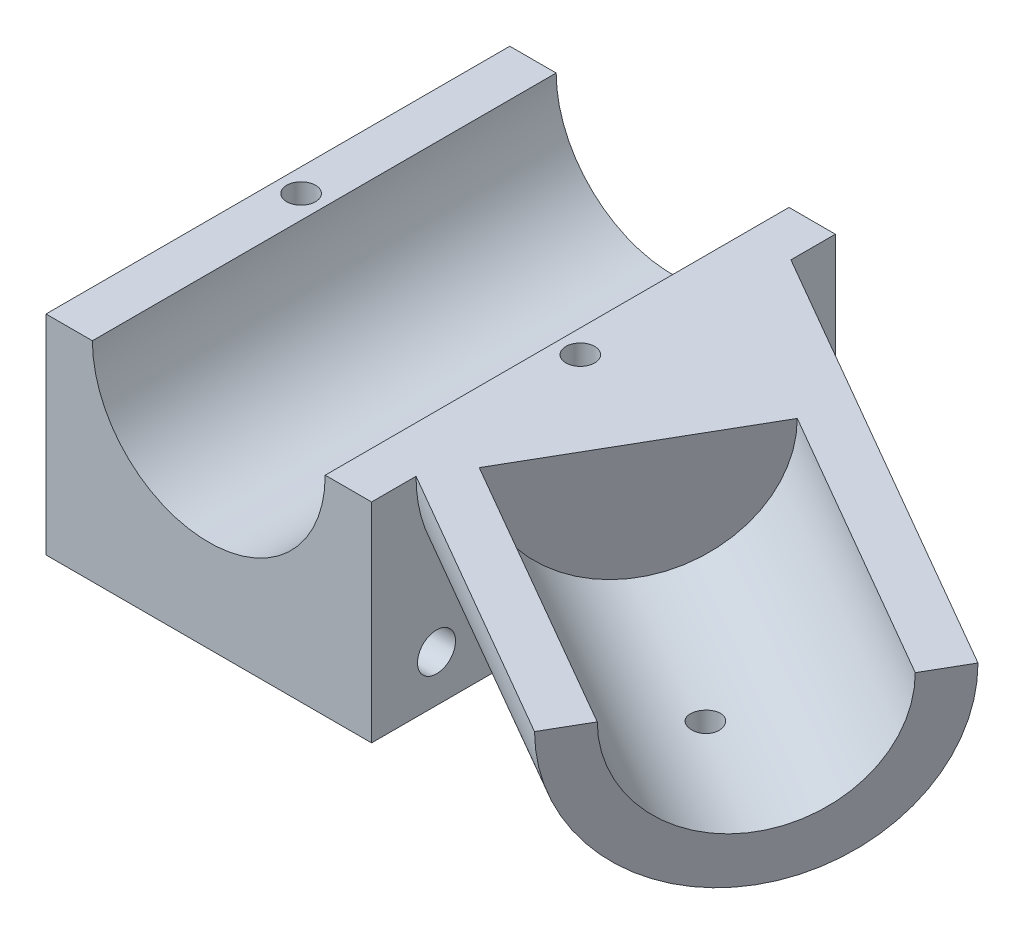
ISO-10303-21;
HEADER;
FILE_DESCRIPTION(('STEP AP214'),'2;1');
FILE_NAME('part.step','',(''),(''),'','','');
FILE_SCHEMA(('AUTOMOTIVE_DESIGN { 1 0 10303 214 1 1 1 1 }'));
ENDSEC;
DATA;
#1=APPLICATION_CONTEXT('core data for automotive mechanical design processes');
#2=APPLICATION_PROTOCOL_DEFINITION('international standard','automotive_design',2000,#1);
#3=PRODUCT_CONTEXT('',#1,'mechanical');
#4=PRODUCT('Part','Part','',(#3));
#5=PRODUCT_RELATED_PRODUCT_CATEGORY('part','',(#4));
#6=PRODUCT_DEFINITION_FORMATION('','',#4);
#7=PRODUCT_DEFINITION_CONTEXT('part definition',#1,'design');
#8=PRODUCT_DEFINITION('design','',#6,#7);
#9=PRODUCT_DEFINITION_SHAPE('','',#8);
#10=(LENGTH_UNIT() NAMED_UNIT(*) SI_UNIT(.MILLI.,.METRE.));
#11=(NAMED_UNIT(*) PLANE_ANGLE_UNIT() SI_UNIT($,.RADIAN.));
#12=(NAMED_UNIT(*) SI_UNIT($,.STERADIAN.) SOLID_ANGLE_UNIT());
#13=UNCERTAINTY_MEASURE_WITH_UNIT(LENGTH_MEASURE(1.E-05),#10,'distance_accuracy_value','');
#14=(GEOMETRIC_REPRESENTATION_CONTEXT(3) GLOBAL_UNCERTAINTY_ASSIGNED_CONTEXT((#13)) GLOBAL_UNIT_ASSIGNED_CONTEXT((#10,
#11,#12)) REPRESENTATION_CONTEXT('',''));
#15=CARTESIAN_POINT('',(0.,0.,0.));
#16=DIRECTION('',(0.,0.,1.));
#17=DIRECTION('',(1.,0.,0.));
#18=AXIS2_PLACEMENT_3D('',#15,#16,#17);
#19=CARTESIAN_POINT('',(17.55,0.,25.));
#20=DIRECTION('',(-1.,0.,0.));
#21=DIRECTION('',(0.,-1.,0.));
#22=AXIS2_PLACEMENT_3D('',#19,#20,#21);
#23=PLANE('',#22);
#24=CARTESIAN_POINT('',(17.55,5.,-18.));
#25=DIRECTION('',(-1.,0.,0.));
#26=DIRECTION('',(0.,-1.,0.));
#27=AXIS2_PLACEMENT_3D('',#24,#25,#26);
#28=CIRCLE('',#27,2.05);
#29=CARTESIAN_POINT('',(17.55,2.95,-18.));
#30=VERTEX_POINT('',#29);
#31=EDGE_CURVE('E283',#30,#30,#28,.F.);
#32=ORIENTED_EDGE('',*,*,#31,.F.);
#33=EDGE_LOOP('',(#32));
#34=FACE_BOUND('',#33,.T.);
#35=CARTESIAN_POINT('',(17.55,5.,18.));
#36=DIRECTION('',(-1.,0.,0.));
#37=DIRECTION('',(0.,-1.,0.));
#38=AXIS2_PLACEMENT_3D('',#35,#36,#37);
#39=CIRCLE('',#38,2.05);
#40=CARTESIAN_POINT('',(17.55,2.95,18.));
#41=VERTEX_POINT('',#40);
#42=EDGE_CURVE('E279',#41,#41,#39,.F.);
#43=ORIENTED_EDGE('',*,*,#42,.F.);
#44=EDGE_LOOP('',(#43));
#45=FACE_BOUND('',#44,.T.);
#46=CARTESIAN_POINT('',(17.55,22.5,0.));
#47=DIRECTION('',(-1.,0.,0.));
#48=DIRECTION('',(0.,0.,1.));
#49=AXIS2_PLACEMENT_3D('',#46,#47,#48);
#50=ELLIPSE('',#49,20.2072594216369,17.5);
#51=CARTESIAN_POINT('',(17.55,22.5,20.2072594216369));
#52=VERTEX_POINT('',#51);
#53=CARTESIAN_POINT('',(17.55,22.5,-20.2072594216369));
#54=VERTEX_POINT('',#53);
#55=EDGE_CURVE('E59',#52,#54,#50,.F.);
#56=ORIENTED_EDGE('',*,*,#55,.F.);
#57=DIRECTION('',(0.,0.,-1.));
#58=VECTOR('',#57,1.);
#59=CARTESIAN_POINT('',(17.55,22.5,25.));
#60=LINE('',#59,#58);
#61=CARTESIAN_POINT('',(17.55,22.5,25.));
#62=VERTEX_POINT('',#61);
#63=EDGE_CURVE('E190',#62,#52,#60,.T.);
#64=ORIENTED_EDGE('',*,*,#63,.F.);
#65=DIRECTION('',(0.,1.,0.));
#66=VECTOR('',#65,1.);
#67=CARTESIAN_POINT('',(17.55,0.,25.));
#68=LINE('',#67,#66);
#69=CARTESIAN_POINT('',(17.55,0.,25.));
#70=VERTEX_POINT('',#69);
#71=EDGE_CURVE('E167',#70,#62,#68,.T.);
#72=ORIENTED_EDGE('',*,*,#71,.F.);
#73=DIRECTION('',(0.,0.,-1.));
#74=VECTOR('',#73,1.);
#75=CARTESIAN_POINT('',(17.55,0.,25.));
#76=LINE('',#75,#74);
#77=CARTESIAN_POINT('',(17.55,0.,-25.));
#78=VERTEX_POINT('',#77);
#79=EDGE_CURVE('E192',#70,#78,#76,.T.);
#80=ORIENTED_EDGE('',*,*,#79,.T.);
#81=DIRECTION('',(0.,1.,0.));
#82=VECTOR('',#81,1.);
#83=CARTESIAN_POINT('',(17.55,0.,-25.));
#84=LINE('',#83,#82);
#85=CARTESIAN_POINT('',(17.55,22.5,-25.));
#86=VERTEX_POINT('',#85);
#87=EDGE_CURVE('E180',#78,#86,#84,.T.);
#88=ORIENTED_EDGE('',*,*,#87,.T.);
#89=EDGE_CURVE('E54',#54,#86,#60,.T.);
#90=ORIENTED_EDGE('',*,*,#89,.F.);
#91=EDGE_LOOP('',(#56,#64,#72,#80,#88,#90));
#92=FACE_BOUND('',#91,.T.);
#93=ADVANCED_FACE('F33',(#34,#45,#92),#23,.F.);
#94=CARTESIAN_POINT('',(-17.55,22.5,25.));
#95=DIRECTION('',(0.,-1.,0.));
#96=DIRECTION('',(0.,0.,-1.));
#97=AXIS2_PLACEMENT_3D('',#94,#95,#96);
#98=PLANE('',#97);
#99=CARTESIAN_POINT('',(-15.05,22.5,0.));
#100=DIRECTION('',(0.,1.,0.));
#101=DIRECTION('',(0.,0.,1.));
#102=AXIS2_PLACEMENT_3D('',#99,#100,#101);
#103=CIRCLE('',#102,1.55);
#104=CARTESIAN_POINT('',(-15.05,22.5,1.55));
#105=VERTEX_POINT('',#104);
#106=EDGE_CURVE('E147',#105,#105,#103,.T.);
#107=ORIENTED_EDGE('',*,*,#106,.F.);
#108=EDGE_LOOP('',(#107));
#109=FACE_BOUND('',#108,.T.);
#110=DIRECTION('',(-1.,0.,0.));
#111=VECTOR('',#110,1.);
#112=CARTESIAN_POINT('',(-17.55,22.5,-25.));
#113=LINE('',#112,#111);
#114=CARTESIAN_POINT('',(-12.55,22.5,-25.));
#115=VERTEX_POINT('',#114);
#116=CARTESIAN_POINT('',(-17.55,22.5,-25.));
#117=VERTEX_POINT('',#116);
#118=EDGE_CURVE('E154',#115,#117,#113,.T.);
#119=ORIENTED_EDGE('',*,*,#118,.T.);
#120=DIRECTION('',(0.,0.,-1.));
#121=VECTOR('',#120,1.);
#122=CARTESIAN_POINT('',(-17.55,22.5,25.));
#123=LINE('',#122,#121);
#124=CARTESIAN_POINT('',(-17.55,22.5,25.));
#125=VERTEX_POINT('',#124);
#126=EDGE_CURVE('E11',#125,#117,#123,.T.);
#127=ORIENTED_EDGE('',*,*,#126,.F.);
#128=DIRECTION('',(-1.,0.,0.));
#129=VECTOR('',#128,1.);
#130=CARTESIAN_POINT('',(-17.55,22.5,25.));
#131=LINE('',#130,#129);
#132=CARTESIAN_POINT('',(-12.55,22.5,25.));
#133=VERTEX_POINT('',#132);
#134=EDGE_CURVE('E159',#133,#125,#131,.T.);
#135=ORIENTED_EDGE('',*,*,#134,.F.);
#136=DIRECTION('',(0.,0.,-1.));
#137=VECTOR('',#136,1.);
#138=CARTESIAN_POINT('',(-12.55,22.5,25.));
#139=LINE('',#138,#137);
#140=EDGE_CURVE('E173',#133,#115,#139,.T.);
#141=ORIENTED_EDGE('',*,*,#140,.T.);
#142=EDGE_LOOP('',(#119,#127,#135,#141));
#143=FACE_BOUND('',#142,.T.);
#144=ADVANCED_FACE('F35',(#109,#143),#98,.F.);
#145=CARTESIAN_POINT('',(-17.55,22.5,25.));
#146=DIRECTION('',(1.,0.,0.));
#147=DIRECTION('',(0.,1.,0.));
#148=AXIS2_PLACEMENT_3D('',#145,#146,#147);
#149=PLANE('',#148);
#150=CARTESIAN_POINT('',(-17.55,5.,-18.));
#151=DIRECTION('',(-1.,0.,0.));
#152=DIRECTION('',(0.,0.,1.));
#153=AXIS2_PLACEMENT_3D('',#150,#151,#152);
#154=CIRCLE('',#153,2.05);
#155=CARTESIAN_POINT('',(-17.55,5.,-15.95));
#156=VERTEX_POINT('',#155);
#157=EDGE_CURVE('E275',#156,#156,#154,.T.);
#158=ORIENTED_EDGE('',*,*,#157,.F.);
#159=EDGE_LOOP('',(#158));
#160=FACE_BOUND('',#159,.T.);
#161=CARTESIAN_POINT('',(-17.55,5.,18.));
#162=DIRECTION('',(-1.,0.,0.));
#163=DIRECTION('',(0.,0.,1.));
#164=AXIS2_PLACEMENT_3D('',#161,#162,#163);
#165=CIRCLE('',#164,2.05);
#166=CARTESIAN_POINT('',(-17.55,5.,20.05));
#167=VERTEX_POINT('',#166);
#168=EDGE_CURVE('E123',#167,#167,#165,.T.);
#169=ORIENTED_EDGE('',*,*,#168,.F.);
#170=EDGE_LOOP('',(#169));
#171=FACE_BOUND('',#170,.T.);
#172=DIRECTION('',(0.,-1.,0.));
#173=VECTOR('',#172,1.);
#174=CARTESIAN_POINT('',(-17.55,22.5,-25.));
#175=LINE('',#174,#173);
#176=CARTESIAN_POINT('',(-17.55,0.,-25.));
#177=VERTEX_POINT('',#176);
#178=EDGE_CURVE('E176',#117,#177,#175,.T.);
#179=ORIENTED_EDGE('',*,*,#178,.T.);
#180=DIRECTION('',(0.,0.,-1.));
#181=VECTOR('',#180,1.);
#182=CARTESIAN_POINT('',(-17.55,0.,25.));
#183=LINE('',#182,#181);
#184=CARTESIAN_POINT('',(-17.55,0.,25.));
#185=VERTEX_POINT('',#184);
#186=EDGE_CURVE('E47',#185,#177,#183,.T.);
#187=ORIENTED_EDGE('',*,*,#186,.F.);
#188=DIRECTION('',(0.,-1.,0.));
#189=VECTOR('',#188,1.);
#190=CARTESIAN_POINT('',(-17.55,22.5,25.));
#191=LINE('',#190,#189);
#192=EDGE_CURVE('E162',#125,#185,#191,.T.);
#193=ORIENTED_EDGE('',*,*,#192,.F.);
#194=ORIENTED_EDGE('',*,*,#126,.T.);
#195=EDGE_LOOP('',(#179,#187,#193,#194));
#196=FACE_BOUND('',#195,.T.);
#197=ADVANCED_FACE('F216',(#160,#171,#196),#149,.F.);
#198=CARTESIAN_POINT('',(-17.55,0.,25.));
#199=DIRECTION('',(0.,1.,0.));
#200=DIRECTION('',(0.,0.,1.));
#201=AXIS2_PLACEMENT_3D('',#198,#199,#200);
#202=PLANE('',#201);
#203=CARTESIAN_POINT('',(-15.05,0.,0.));
#204=DIRECTION('',(0.,1.,0.));
#205=DIRECTION('',(0.,0.,1.));
#206=AXIS2_PLACEMENT_3D('',#203,#204,#205);
#207=CIRCLE('',#206,1.55);
#208=CARTESIAN_POINT('',(-15.05,0.,1.55));
#209=VERTEX_POINT('',#208);
#210=EDGE_CURVE('E150',#209,#209,#207,.F.);
#211=ORIENTED_EDGE('',*,*,#210,.F.);
#212=EDGE_LOOP('',(#211));
#213=FACE_BOUND('',#212,.T.);
#214=CARTESIAN_POINT('',(15.05,0.,0.));
#215=DIRECTION('',(0.,1.,0.));
#216=DIRECTION('',(0.,0.,1.));
#217=AXIS2_PLACEMENT_3D('',#214,#215,#216);
#218=CIRCLE('',#217,1.55);
#219=CARTESIAN_POINT('',(15.05,0.,1.55));
#220=VERTEX_POINT('',#219);
#221=EDGE_CURVE('E151',#220,#220,#218,.F.);
#222=ORIENTED_EDGE('',*,*,#221,.F.);
#223=EDGE_LOOP('',(#222));
#224=FACE_BOUND('',#223,.T.);
#225=DIRECTION('',(1.,0.,0.));
#226=VECTOR('',#225,1.);
#227=CARTESIAN_POINT('',(-17.55,0.,-25.));
#228=LINE('',#227,#226);
#229=EDGE_CURVE('E178',#177,#78,#228,.T.);
#230=ORIENTED_EDGE('',*,*,#229,.T.);
#231=ORIENTED_EDGE('',*,*,#79,.F.);
#232=DIRECTION('',(1.,0.,0.));
#233=VECTOR('',#232,1.);
#234=CARTESIAN_POINT('',(-17.55,0.,25.));
#235=LINE('',#234,#233);
#236=EDGE_CURVE('E165',#185,#70,#235,.T.);
#237=ORIENTED_EDGE('',*,*,#236,.F.);
#238=ORIENTED_EDGE('',*,*,#186,.T.);
#239=EDGE_LOOP('',(#230,#231,#237,#238));
#240=FACE_BOUND('',#239,.T.);
#241=ADVANCED_FACE('F200',(#213,#224,#240),#202,.F.);
#242=CARTESIAN_POINT('',(17.55,22.5,25.));
#243=DIRECTION('',(0.,-1.,0.));
#244=DIRECTION('',(0.,0.,-1.));
#245=AXIS2_PLACEMENT_3D('',#242,#243,#244);
#246=PLANE('',#245);
#247=DIRECTION('',(-0.5,0.,0.866025403784439));
#248=VECTOR('',#247,1.);
#249=CARTESIAN_POINT('',(20.1480762113533,22.5,15.9914917566596));
#250=LINE('',#249,#248);
#251=CARTESIAN_POINT('',(32.6980762113533,22.5,-5.74574587832974));
#252=VERTEX_POINT('',#251);
#253=CARTESIAN_POINT('',(20.1480762113533,22.5,15.9914917566596));
#254=VERTEX_POINT('',#253);
#255=EDGE_CURVE('E115',#252,#254,#250,.T.);
#256=ORIENTED_EDGE('',*,*,#255,.F.);
#257=DIRECTION('',(-0.866025403784438,0.,-0.500000000000001));
#258=VECTOR('',#257,1.);
#259=CARTESIAN_POINT('',(62.7961431702997,22.5,11.6313811825053));
#260=LINE('',#259,#258);
#261=CARTESIAN_POINT('',(62.7961431702997,22.5,11.6313811825053));
#262=VERTEX_POINT('',#261);
#263=EDGE_CURVE('E131',#262,#252,#260,.T.);
#264=ORIENTED_EDGE('',*,*,#263,.F.);
#265=DIRECTION('',(-0.500000000000001,0.,0.866025403784438));
#266=VECTOR('',#265,1.);
#267=CARTESIAN_POINT('',(62.7961431702997,22.5,11.6313811825053));
#268=LINE('',#267,#266);
#269=CARTESIAN_POINT('',(65.2711431702997,22.5,7.34455543377238));
#270=VERTEX_POINT('',#269);
#271=EDGE_CURVE('E223',#270,#262,#268,.T.);
#272=ORIENTED_EDGE('',*,*,#271,.F.);
#273=DIRECTION('',(-0.866025403784438,0.,-0.500000000000001));
#274=VECTOR('',#273,1.);
#275=CARTESIAN_POINT('',(65.2711431702997,22.5,7.34455543377238));
#276=LINE('',#275,#274);
#277=EDGE_CURVE('E139',#270,#54,#276,.T.);
#278=ORIENTED_EDGE('',*,*,#277,.T.);
#279=ORIENTED_EDGE('',*,*,#89,.T.);
#280=DIRECTION('',(-1.,0.,0.));
#281=VECTOR('',#280,1.);
#282=CARTESIAN_POINT('',(17.55,22.5,-25.));
#283=LINE('',#282,#281);
#284=CARTESIAN_POINT('',(12.55,22.5,-25.));
#285=VERTEX_POINT('',#284);
#286=EDGE_CURVE('E182',#86,#285,#283,.T.);
#287=ORIENTED_EDGE('',*,*,#286,.T.);
#288=DIRECTION('',(0.,0.,-1.));
#289=VECTOR('',#288,1.);
#290=CARTESIAN_POINT('',(12.55,22.5,25.));
#291=LINE('',#290,#289);
#292=CARTESIAN_POINT('',(12.55,22.5,25.));
#293=VERTEX_POINT('',#292);
#294=EDGE_CURVE('E187',#293,#285,#291,.T.);
#295=ORIENTED_EDGE('',*,*,#294,.F.);
#296=DIRECTION('',(-1.,0.,0.));
#297=VECTOR('',#296,1.);
#298=CARTESIAN_POINT('',(17.55,22.5,25.));
#299=LINE('',#298,#297);
#300=EDGE_CURVE('E169',#62,#293,#299,.T.);
#301=ORIENTED_EDGE('',*,*,#300,.F.);
#302=ORIENTED_EDGE('',*,*,#63,.T.);
#303=DIRECTION('',(-0.866025403784438,0.,-0.500000000000001));
#304=VECTOR('',#303,1.);
#305=CARTESIAN_POINT('',(47.7711431702997,22.5,37.6554445662277));
#306=LINE('',#305,#304);
#307=CARTESIAN_POINT('',(47.7711431702997,22.5,37.6554445662277));
#308=VERTEX_POINT('',#307);
#309=EDGE_CURVE('E137',#308,#52,#306,.T.);
#310=ORIENTED_EDGE('',*,*,#309,.F.);
#311=DIRECTION('',(-0.500000000000001,0.,0.866025403784438));
#312=VECTOR('',#311,1.);
#313=CARTESIAN_POINT('',(47.7711431702997,22.5,37.6554445662277));
#314=LINE('',#313,#312);
#315=CARTESIAN_POINT('',(50.2461431702997,22.5,33.3686188174947));
#316=VERTEX_POINT('',#315);
#317=EDGE_CURVE('E136',#316,#308,#314,.T.);
#318=ORIENTED_EDGE('',*,*,#317,.F.);
#319=DIRECTION('',(-0.866025403784438,0.,-0.500000000000001));
#320=VECTOR('',#319,1.);
#321=CARTESIAN_POINT('',(50.2461431702997,22.5,33.3686188174947));
#322=LINE('',#321,#320);
#323=EDGE_CURVE('E129',#316,#254,#322,.T.);
#324=ORIENTED_EDGE('',*,*,#323,.T.);
#325=EDGE_LOOP('',(#256,#264,#272,#278,#279,#287,#295,#301,#302,#310,#318,#324));
#326=FACE_BOUND('',#325,.T.);
#327=CARTESIAN_POINT('',(15.05,22.5,0.));
#328=DIRECTION('',(0.,1.,0.));
#329=DIRECTION('',(0.,0.,1.));
#330=AXIS2_PLACEMENT_3D('',#327,#328,#329);
#331=CIRCLE('',#330,1.55);
#332=CARTESIAN_POINT('',(15.05,22.5,1.55));
#333=VERTEX_POINT('',#332);
#334=EDGE_CURVE('E146',#333,#333,#331,.T.);
#335=ORIENTED_EDGE('',*,*,#334,.F.);
#336=EDGE_LOOP('',(#335));
#337=FACE_BOUND('',#336,.T.);
#338=ADVANCED_FACE('F133',(#326,#337),#246,.F.);
#339=CARTESIAN_POINT('',(0.,22.5,25.));
#340=DIRECTION('',(0.,0.,-1.));
#341=DIRECTION('',(-1.,0.,0.));
#342=AXIS2_PLACEMENT_3D('',#339,#340,#341);
#343=CYLINDRICAL_SURFACE('',#342,12.55);
#344=CARTESIAN_POINT('',(0.,22.5,-25.));
#345=DIRECTION('',(0.,0.,-1.));
#346=DIRECTION('',(1.,0.,0.));
#347=AXIS2_PLACEMENT_3D('',#344,#345,#346);
#348=CIRCLE('',#347,12.55);
#349=EDGE_CURVE('E163',#285,#115,#348,.T.);
#350=ORIENTED_EDGE('',*,*,#349,.T.);
#351=ORIENTED_EDGE('',*,*,#140,.F.);
#352=CARTESIAN_POINT('',(0.,22.5,25.));
#353=DIRECTION('',(0.,0.,-1.));
#354=DIRECTION('',(1.,0.,0.));
#355=AXIS2_PLACEMENT_3D('',#352,#353,#354);
#356=CIRCLE('',#355,12.55);
#357=EDGE_CURVE('E171',#293,#133,#356,.T.);
#358=ORIENTED_EDGE('',*,*,#357,.F.);
#359=ORIENTED_EDGE('',*,*,#294,.T.);
#360=EDGE_LOOP('',(#350,#351,#358,#359));
#361=FACE_BOUND('',#360,.T.);
#362=ADVANCED_FACE('F220',(#361),#343,.F.);
#363=CARTESIAN_POINT('',(0.,22.5,25.));
#364=DIRECTION('',(0.,0.,1.));
#365=DIRECTION('',(1.,0.,0.));
#366=AXIS2_PLACEMENT_3D('',#363,#364,#365);
#367=PLANE('',#366);
#368=ORIENTED_EDGE('',*,*,#134,.T.);
#369=ORIENTED_EDGE('',*,*,#192,.T.);
#370=ORIENTED_EDGE('',*,*,#236,.T.);
#371=ORIENTED_EDGE('',*,*,#71,.T.);
#372=ORIENTED_EDGE('',*,*,#300,.T.);
#373=ORIENTED_EDGE('',*,*,#357,.T.);
#374=EDGE_LOOP('',(#368,#369,#370,#371,#372,#373));
#375=FACE_BOUND('',#374,.T.);
#376=ADVANCED_FACE('F212',(#375),#367,.T.);
#377=CARTESIAN_POINT('',(0.,22.5,-25.));
#378=DIRECTION('',(0.,0.,1.));
#379=DIRECTION('',(1.,0.,0.));
#380=AXIS2_PLACEMENT_3D('',#377,#378,#379);
#381=PLANE('',#380);
#382=ORIENTED_EDGE('',*,*,#118,.F.);
#383=ORIENTED_EDGE('',*,*,#349,.F.);
#384=ORIENTED_EDGE('',*,*,#286,.F.);
#385=ORIENTED_EDGE('',*,*,#87,.F.);
#386=ORIENTED_EDGE('',*,*,#229,.F.);
#387=ORIENTED_EDGE('',*,*,#178,.F.);
#388=EDGE_LOOP('',(#382,#383,#384,#385,#386,#387));
#389=FACE_BOUND('',#388,.T.);
#390=ADVANCED_FACE('F206',(#389),#381,.F.);
#391=CARTESIAN_POINT('',(15.05,-4.3840620433566,0.));
#392=DIRECTION('',(0.,1.,0.));
#393=DIRECTION('',(0.,0.,1.));
#394=AXIS2_PLACEMENT_3D('',#391,#392,#393);
#395=CYLINDRICAL_SURFACE('',#394,1.55);
#396=ORIENTED_EDGE('',*,*,#221,.T.);
#397=EDGE_LOOP('',(#396));
#398=FACE_BOUND('',#397,.T.);
#399=ORIENTED_EDGE('',*,*,#334,.T.);
#400=EDGE_LOOP('',(#399));
#401=FACE_BOUND('',#400,.T.);
#402=ADVANCED_FACE('F363',(#398,#401),#395,.F.);
#403=CARTESIAN_POINT('',(-15.05,-4.3840620433566,0.));
#404=DIRECTION('',(0.,1.,0.));
#405=DIRECTION('',(0.,0.,1.));
#406=AXIS2_PLACEMENT_3D('',#403,#404,#405);
#407=CYLINDRICAL_SURFACE('',#406,1.55);
#408=ORIENTED_EDGE('',*,*,#210,.T.);
#409=EDGE_LOOP('',(#408));
#410=FACE_BOUND('',#409,.T.);
#411=ORIENTED_EDGE('',*,*,#106,.T.);
#412=EDGE_LOOP('',(#411));
#413=FACE_BOUND('',#412,.T.);
#414=ADVANCED_FACE('F369',(#410,#413),#407,.F.);
#415=CARTESIAN_POINT('',(56.5211431702997,22.5,22.5));
#416=DIRECTION('',(-0.866025403784438,0.,-0.500000000000001));
#417=DIRECTION('',(-0.500000000000001,0.,0.866025403784438));
#418=AXIS2_PLACEMENT_3D('',#415,#416,#417);
#419=CYLINDRICAL_SURFACE('',#418,17.5);
#420=CARTESIAN_POINT('',(41.9807621135332,5.01716913654998,15.));
#421=CARTESIAN_POINT('',(41.9807657759947,5.01383662006701,14.913178147149));
#422=CARTESIAN_POINT('',(41.9880805438422,5.01082839824436,14.826286240255));
#423=CARTESIAN_POINT('',(42.0171727847243,5.00580127031913,14.654860968194));
#424=CARTESIAN_POINT('',(42.038965840308,5.00378343421215,14.5703302465553));
#425=CARTESIAN_POINT('',(42.0964109955829,5.00096725665342,14.4061164094643));
#426=CARTESIAN_POINT('',(42.1320586741092,5.00016852657154,14.3264317569487));
#427=CARTESIAN_POINT('',(42.2161949497872,4.99987974246332,14.1741808235086));
#428=CARTESIAN_POINT('',(42.2646805861065,5.00038938692047,14.101612906525));
#429=CARTESIAN_POINT('',(42.3730246558008,5.0026573955707,13.9657460127227));
#430=CARTESIAN_POINT('',(42.432864789978,5.00441376282869,13.90243240815));
#431=CARTESIAN_POINT('',(42.5622688969692,5.00897651481142,13.786717069692));
#432=CARTESIAN_POINT('',(42.6318333369309,5.01178294999143,13.7343158603305));
#433=CARTESIAN_POINT('',(42.7788508262595,5.01813823538495,13.6418077880952));
#434=CARTESIAN_POINT('',(42.8563179211583,5.02168841970078,13.6017233415664));
#435=CARTESIAN_POINT('',(43.0168557364662,5.02913117675068,13.5350926049501));
#436=CARTESIAN_POINT('',(43.0999265727142,5.03302375656317,13.5085465948223));
#437=CARTESIAN_POINT('',(43.2696258847987,5.04072877895562,13.4696699663186));
#438=CARTESIAN_POINT('',(43.3562652333685,5.04454091338457,13.457386725602));
#439=CARTESIAN_POINT('',(43.5303980237424,5.05164144011879,13.44754887423));
#440=CARTESIAN_POINT('',(43.6178914619267,5.05492983464278,13.4499942011784));
#441=CARTESIAN_POINT('',(43.7912231935161,5.06060907638196,13.4695543878783));
#442=CARTESIAN_POINT('',(43.8770620550395,5.06300023707504,13.4866641172683));
#443=CARTESIAN_POINT('',(44.0446663242073,5.06661414653735,13.5350731648724));
#444=CARTESIAN_POINT('',(44.1264318269812,5.06783692260528,13.5663721515367));
#445=CARTESIAN_POINT('',(44.2832718821034,5.06897232868954,13.6421386086808));
#446=CARTESIAN_POINT('',(44.3583687872732,5.06888951565134,13.6865597457972));
#447=CARTESIAN_POINT('',(44.5000530409642,5.06743434183761,13.7873446481524));
#448=CARTESIAN_POINT('',(44.5666404559062,5.06606199112824,13.8437083201648));
#449=CARTESIAN_POINT('',(44.6893479082733,5.06218590741732,13.9666964750813));
#450=CARTESIAN_POINT('',(44.745480150344,5.05968350539961,14.0333088263269));
#451=CARTESIAN_POINT('',(44.8458037436991,5.05382995383001,14.174955694493));
#452=CARTESIAN_POINT('',(44.8899948530948,5.05047878708756,14.2499903819791));
#453=CARTESIAN_POINT('',(44.9653194471605,5.04329294218684,14.4066045810336));
#454=CARTESIAN_POINT('',(44.9964136915189,5.03945685514601,14.4882029006129));
#455=CARTESIAN_POINT('',(45.0444861966706,5.03173992143045,14.6554556546848));
#456=CARTESIAN_POINT('',(45.061464220259,5.02785907400469,14.7411101573107));
#457=CARTESIAN_POINT('',(45.0808470111027,5.02047846570701,14.9142864772098));
#458=CARTESIAN_POINT('',(45.083215445864,5.01697967615835,15.0018124071132));
#459=CARTESIAN_POINT('',(45.0732024320952,5.01076865087211,15.1760450910998));
#460=CARTESIAN_POINT('',(45.0608211764509,5.00805640484927,15.2627518558804));
#461=CARTESIAN_POINT('',(45.0216834873487,5.00372872988006,15.4327172143567));
#462=CARTESIAN_POINT('',(44.9949538622353,5.00211126815142,15.5159819276787));
#463=CARTESIAN_POINT('',(44.9278886599814,5.00014754659018,15.6768540266142));
#464=CARTESIAN_POINT('',(44.887553389398,4.99980125811808,15.7544615396458));
#465=CARTESIAN_POINT('',(44.7945826296592,5.00041785805974,15.9015559470152));
#466=CARTESIAN_POINT('',(44.7419880258816,5.00137644499908,15.97106870669));
#467=CARTESIAN_POINT('',(44.6259258963292,5.00448759917551,16.1002995787996));
#468=CARTESIAN_POINT('',(44.562458334394,5.00664017038351,16.1600176586586));
#469=CARTESIAN_POINT('',(44.4264271719878,5.01189939044296,16.2680018017968));
#470=CARTESIAN_POINT('',(44.3538599692188,5.01500641784757,16.3162633077209));
#471=CARTESIAN_POINT('',(44.2016971333181,5.02182714460867,16.3999593943105));
#472=CARTESIAN_POINT('',(44.1221013422164,5.02554085760223,16.4353936865888));
#473=CARTESIAN_POINT('',(43.9578281173659,5.03317385659464,16.4925494262309));
#474=CARTESIAN_POINT('',(43.8731340242871,5.03709381059749,16.5142229113286));
#475=CARTESIAN_POINT('',(43.7012981010484,5.04468670776343,16.5430512811335));
#476=CARTESIAN_POINT('',(43.6141562472235,5.04835964853723,16.5502060254244));
#477=CARTESIAN_POINT('',(43.4397796297081,5.05504801662024,16.5497846885194));
#478=CARTESIAN_POINT('',(43.3525448756622,5.05806267528599,16.5421914881169));
#479=CARTESIAN_POINT('',(43.1805652576972,5.06308628556392,16.512440821276));
#480=CARTESIAN_POINT('',(43.0958203458407,5.06509525655076,16.490283635433));
#481=CARTESIAN_POINT('',(42.931488637064,5.06787394130967,16.4321124525438));
#482=CARTESIAN_POINT('',(42.8518873226342,5.06864730357014,16.3961396417309));
#483=CARTESIAN_POINT('',(42.6998461725477,5.06887806696386,16.311355869986));
#484=CARTESIAN_POINT('',(42.6274059616646,5.06833553708509,16.2625455822011));
#485=CARTESIAN_POINT('',(42.4919225469421,5.06599959234364,16.1536240802443));
#486=CARTESIAN_POINT('',(42.4288556718949,5.06420939574981,16.093542231021));
#487=CARTESIAN_POINT('',(42.313657595807,5.05958340959494,15.9636860427345));
#488=CARTESIAN_POINT('',(42.2615290396066,5.05674736760885,15.8939093662656));
#489=CARTESIAN_POINT('',(42.1695752716029,5.05034188192152,15.746484221453));
#490=CARTESIAN_POINT('',(42.1297791148813,5.04677073874745,15.6688177273204));
#491=CARTESIAN_POINT('',(42.0637965092253,5.03930347280106,15.5079876242804));
#492=CARTESIAN_POINT('',(42.0375953219174,5.03540770729548,15.4248300790039));
#493=CARTESIAN_POINT('',(42.0059937224513,5.02904072597403,15.2843522528059));
#494=CARTESIAN_POINT('',(41.9965450795259,5.02653753305671,15.2279109152589));
#495=CARTESIAN_POINT('',(41.9839280568564,5.02169905718401,15.1143231809311));
#496=CARTESIAN_POINT('',(41.9807597016085,5.0193637748836,15.057176781401));
#497=CARTESIAN_POINT('',(41.9807621135332,5.01716913654998,15.));
#498=B_SPLINE_CURVE_WITH_KNOTS('',3,(#420,#421,#422,#423,#424,#425,#426,#427,#428,#429,#430,
#431,#432,#433,#434,#435,#436,#437,#438,#439,#440,#441,#442,#443,#444,#445,#446,#447,#448,#449,
#450,#451,#452,#453,#454,#455,#456,#457,#458,#459,#460,#461,#462,#463,#464,#465,#466,#467,#468,
#469,#470,#471,#472,#473,#474,#475,#476,#477,#478,#479,#480,#481,#482,#483,#484,#485,#486,#487,
#488,#489,#490,#491,#492,#493,#494,#495,#496,#497),.UNSPECIFIED.,.T.,.F.,(4,2,2,2,2,2,2,2,2,2,2,
2,2,2,2,2,2,2,2,2,2,2,2,2,2,2,2,2,2,2,2,2,2,2,2,2,2,2,4),(0.,0.260449975240977,0.52118072011794,
0.781828331122857,1.04241588096019,1.30258697448213,1.56277057070823,1.82342493055854,
2.08408468023027,2.34560782717593,2.60712986620343,2.86856044871382,3.12998492288719,
3.39049714027234,3.65100732410743,3.91121147392941,4.1714208942494,4.43240449149244,
4.69339247414054,4.95502924533832,5.21666259508005,5.47780880462443,5.73894913051485,
5.99923069822643,6.2595131315784,6.51989893083308,6.78029058383521,7.04158490107967,
7.30288174539143,7.56448208067966,7.82607737602061,8.08689879924829,8.34770654874312,
8.60784404081797,8.86804436076629,9.12885313099139,9.38937856325417,9.56089797601423,
9.73241805778224),.UNSPECIFIED.);
#499=CARTESIAN_POINT('',(41.9807621135332,5.01716913654998,15.));
#500=VERTEX_POINT('',#499);
#501=EDGE_CURVE('E232',#500,#500,#498,.T.);
#502=ORIENTED_EDGE('',*,*,#501,.F.);
#503=EDGE_LOOP('',(#502));
#504=FACE_BOUND('',#503,.T.);
#505=ORIENTED_EDGE('',*,*,#309,.T.);
#506=ORIENTED_EDGE('',*,*,#55,.T.);
#507=ORIENTED_EDGE('',*,*,#277,.F.);
#508=CARTESIAN_POINT('',(56.5211431702997,22.5,22.5));
#509=DIRECTION('',(0.866025403784438,0.,0.500000000000001));
#510=DIRECTION('',(0.500000000000001,0.,-0.866025403784438));
#511=AXIS2_PLACEMENT_3D('',#508,#509,#510);
#512=CIRCLE('',#511,17.5);
#513=EDGE_CURVE('E228',#308,#270,#512,.T.);
#514=ORIENTED_EDGE('',*,*,#513,.F.);
#515=EDGE_LOOP('',(#505,#506,#507,#514));
#516=FACE_BOUND('',#515,.T.);
#517=ADVANCED_FACE('F227',(#504,#516),#419,.T.);
#518=CARTESIAN_POINT('',(56.5211431702997,22.5,22.5));
#519=DIRECTION('',(-0.866025403784438,0.,-0.500000000000001));
#520=DIRECTION('',(-0.500000000000001,0.,0.866025403784438));
#521=AXIS2_PLACEMENT_3D('',#518,#519,#520);
#522=CYLINDRICAL_SURFACE('',#521,12.55);
#523=CARTESIAN_POINT('',(41.9807621135332,9.97395213964117,15.));
#524=CARTESIAN_POINT('',(41.9807655655199,9.96931305656321,14.913405888075));
#525=CARTESIAN_POINT('',(41.9880413412542,9.96512508352439,14.8267351428981));
#526=CARTESIAN_POINT('',(42.0169912779068,9.95812218146425,14.6557138259931));
#527=CARTESIAN_POINT('',(42.0386792440947,9.95530857341912,14.5713655596966));
#528=CARTESIAN_POINT('',(42.0958685554592,9.95137319699484,14.4074542436374));
#529=CARTESIAN_POINT('',(42.131367547515,9.95025114056803,14.3278903813732));
#530=CARTESIAN_POINT('',(42.2151678597574,9.94982465262881,14.1758356770126));
#531=CARTESIAN_POINT('',(42.2634664447629,9.95051983306694,14.103343328307));
#532=CARTESIAN_POINT('',(42.3713093169388,9.95364367812104,13.9676953030563));
#533=CARTESIAN_POINT('',(42.4308173181853,9.95606681778542,13.9045106411735));
#534=CARTESIAN_POINT('',(42.5594858355009,9.9623711087218,13.7889674609741));
#535=CARTESIAN_POINT('',(42.628646887846,9.96625234101854,13.7366095445396));
#536=CARTESIAN_POINT('',(42.7749257482969,9.9750586710897,13.6440018601564));
#537=CARTESIAN_POINT('',(42.8520703534688,9.97998734704843,13.6037947710894));
#538=CARTESIAN_POINT('',(43.0119625852829,9.99033370759421,13.5368321132665));
#539=CARTESIAN_POINT('',(43.0947104477556,9.99575141276678,13.5100771110834));
#540=CARTESIAN_POINT('',(43.2640652502789,10.0065093861691,13.4706274725239));
#541=CARTESIAN_POINT('',(43.3506936375693,10.0118489296086,13.4580246319111));
#542=CARTESIAN_POINT('',(43.5248784760574,10.0218114940053,13.4475575211408));
#543=CARTESIAN_POINT('',(43.6124349220836,10.0264345189529,13.4496931688978));
#544=CARTESIAN_POINT('',(43.7859512960334,10.0344350421613,13.4686637625525));
#545=CARTESIAN_POINT('',(43.8719121039304,10.0378132475487,13.4854903448222));
#546=CARTESIAN_POINT('',(44.039822954053,10.0429389690124,13.5333787383832));
#547=CARTESIAN_POINT('',(44.1217731857047,10.0446865621758,13.5644398766332));
#548=CARTESIAN_POINT('',(44.2787579506155,10.0463430885132,13.6396594018424));
#549=CARTESIAN_POINT('',(44.3538356785062,10.0462644303968,13.683727390834));
#550=CARTESIAN_POINT('',(44.4955539969593,10.0443081555295,13.7837763824313));
#551=CARTESIAN_POINT('',(44.5621947135669,10.0424305656574,13.8397572070309));
#552=CARTESIAN_POINT('',(44.6850084045371,10.0370976549448,13.9618779857905));
#553=CARTESIAN_POINT('',(44.7412059860561,10.0336461109023,14.0279933707736));
#554=CARTESIAN_POINT('',(44.8417790215166,10.0255560033899,14.1686110729432));
#555=CARTESIAN_POINT('',(44.8861540219993,10.0209173944032,14.2431137116695));
#556=CARTESIAN_POINT('',(44.9620900742662,10.0109424775501,14.3988757519237));
#557=CARTESIAN_POINT('',(44.9935759523802,10.0056023100065,14.4801715532468));
#558=CARTESIAN_POINT('',(45.0425011334829,9.99484291094805,14.6468821195061));
#559=CARTESIAN_POINT('',(45.0599399664774,9.98942367679386,14.7322970221602));
#560=CARTESIAN_POINT('',(45.0803282835986,9.97908476289798,14.9053006893707));
#561=CARTESIAN_POINT('',(45.0832059171086,9.97416767745766,14.9928980945458));
#562=CARTESIAN_POINT('',(45.0741720116011,9.96541769402677,15.1673824658743));
#563=CARTESIAN_POINT('',(45.0622608403166,9.96158476908078,15.2542694496387));
#564=CARTESIAN_POINT('',(45.0240284205313,9.95544717212109,15.4245505454268));
#565=CARTESIAN_POINT('',(44.9977578278857,9.95313719044,15.507955832996));
#566=CARTESIAN_POINT('',(44.9315728457931,9.95028489600403,15.669195892496));
#567=CARTESIAN_POINT('',(44.8916590550852,9.94974250568847,15.7470309086998));
#568=CARTESIAN_POINT('',(44.7996308981169,9.95048405831622,15.8944113021239));
#569=CARTESIAN_POINT('',(44.747596388947,9.9517563151148,15.9640066243872));
#570=CARTESIAN_POINT('',(44.6326786452217,9.95596388401894,16.0935148687121));
#571=CARTESIAN_POINT('',(44.5697953574235,9.95889920428651,16.1534277432521));
#572=CARTESIAN_POINT('',(44.4349291302176,9.96610864525839,16.2619340827702));
#573=CARTESIAN_POINT('',(44.3629406458803,9.97038358413448,16.3105205984668));
#574=CARTESIAN_POINT('',(44.2119153061901,9.97979816976056,16.3949972983807));
#575=CARTESIAN_POINT('',(44.1328781422258,9.98493785438032,16.43088692635));
#576=CARTESIAN_POINT('',(43.969400271246,9.99554967333912,16.4891868834644));
#577=CARTESIAN_POINT('',(43.8849269499586,10.0010238018537,16.5115054235124));
#578=CARTESIAN_POINT('',(43.7134128429001,10.0116596079543,16.5416616286368));
#579=CARTESIAN_POINT('',(43.626372008091,10.0168212795668,16.5494990169494));
#580=CARTESIAN_POINT('',(43.4519423293773,10.0262615156822,16.5504555207429));
#581=CARTESIAN_POINT('',(43.3645531568583,10.0305378680771,16.5435382449558));
#582=CARTESIAN_POINT('',(43.1921308671006,10.0377014439248,16.5150784962178));
#583=CARTESIAN_POINT('',(43.1070976570936,10.040588722147,16.4935365999789));
#584=CARTESIAN_POINT('',(42.9423050351298,10.0446289934458,16.4365845993195));
#585=CARTESIAN_POINT('',(42.8625185007865,10.0457917088095,16.401253668523));
#586=CARTESIAN_POINT('',(42.7099917345766,10.0462799333634,16.3177235900439));
#587=CARTESIAN_POINT('',(42.6372510393978,10.0456055634395,16.2695252892629));
#588=CARTESIAN_POINT('',(42.5012410545837,10.0425056520469,16.1619244017461));
#589=CARTESIAN_POINT('',(42.4379256109969,10.0400890071008,16.1025798646499));
#590=CARTESIAN_POINT('',(42.3220828341848,10.033788054711,15.9742025278607));
#591=CARTESIAN_POINT('',(42.2695580224638,10.0299034048316,15.9051674700618));
#592=CARTESIAN_POINT('',(42.1765769886777,10.021086452298,15.7590859326433));
#593=CARTESIAN_POINT('',(42.1361689488236,10.0161500971408,15.6820090694358));
#594=CARTESIAN_POINT('',(42.0688339805869,10.0057957475365,15.5222691773637));
#595=CARTESIAN_POINT('',(42.0418939542578,10.0003782270971,15.4396116649758));
#596=CARTESIAN_POINT('',(42.0083397402383,9.99132568452191,15.2971669353402));
#597=CARTESIAN_POINT('',(41.9980141013402,9.98765844139592,15.2382284484768));
#598=CARTESIAN_POINT('',(41.9842240752653,9.9805731627467,15.1195388214609));
#599=CARTESIAN_POINT('',(41.9807597301579,9.97715512875161,15.059787676328));
#600=CARTESIAN_POINT('',(41.9807621135332,9.97395213964117,15.));
#601=B_SPLINE_CURVE_WITH_KNOTS('',3,(#523,#524,#525,#526,#527,#528,#529,#530,#531,#532,#533,
#534,#535,#536,#537,#538,#539,#540,#541,#542,#543,#544,#545,#546,#547,#548,#549,#550,#551,#552,
#553,#554,#555,#556,#557,#558,#559,#560,#561,#562,#563,#564,#565,#566,#567,#568,#569,#570,#571,
#572,#573,#574,#575,#576,#577,#578,#579,#580,#581,#582,#583,#584,#585,#586,#587,#588,#589,#590,
#591,#592,#593,#594,#595,#596,#597,#598,#599,#600),.UNSPECIFIED.,.T.,.F.,(4,2,2,2,2,2,2,2,2,2,2,
2,2,2,2,2,2,2,2,2,2,2,2,2,2,2,2,2,2,2,2,2,2,2,2,2,2,2,4),(0.,0.259939312826798,
0.520127978103934,0.780272331871581,1.04036113942429,1.29962205014457,1.55889736986542,
1.81907306452314,2.07925971629989,2.34112445149798,2.60298772825359,2.86470202197811,
3.12640394255167,3.38632821788673,3.6462486096067,3.90554856215571,4.1648584588021,
4.4256598995095,4.68647006590082,4.94856592461909,5.2106552662884,5.47182594493419,
5.73298516343622,5.99247011675036,6.25195634358247,6.51160136147317,6.77125775295122,
7.03265136302644,7.2940499688054,7.55609403994243,7.81812777815093,8.07867860114161,
8.33921227948042,8.59842494116841,8.8576981057294,9.11798899679542,9.37802625425591,
9.55749656541348,9.73696797697637),.UNSPECIFIED.);
#602=CARTESIAN_POINT('',(41.9807621135332,9.97395213964117,15.));
#603=VERTEX_POINT('',#602);
#604=EDGE_CURVE('E37',#603,#603,#601,.T.);
#605=ORIENTED_EDGE('',*,*,#604,.T.);
#606=EDGE_LOOP('',(#605));
#607=FACE_BOUND('',#606,.T.);
#608=ORIENTED_EDGE('',*,*,#263,.T.);
#609=CARTESIAN_POINT('',(26.4230762113533,22.5,5.12287293916494));
#610=DIRECTION('',(0.866025403784439,0.,0.5));
#611=DIRECTION('',(0.5,0.,-0.866025403784439));
#612=AXIS2_PLACEMENT_3D('',#609,#610,#611);
#613=CIRCLE('',#612,12.55);
#614=EDGE_CURVE('E118',#254,#252,#613,.T.);
#615=ORIENTED_EDGE('',*,*,#614,.F.);
#616=ORIENTED_EDGE('',*,*,#323,.F.);
#617=CARTESIAN_POINT('',(56.5211431702997,22.5,22.5));
#618=DIRECTION('',(-0.866025403784438,0.,-0.500000000000001));
#619=DIRECTION('',(0.500000000000001,0.,-0.866025403784438));
#620=AXIS2_PLACEMENT_3D('',#617,#618,#619);
#621=CIRCLE('',#620,12.55);
#622=EDGE_CURVE('E241',#262,#316,#621,.T.);
#623=ORIENTED_EDGE('',*,*,#622,.F.);
#624=EDGE_LOOP('',(#608,#615,#616,#623));
#625=FACE_BOUND('',#624,.T.);
#626=ADVANCED_FACE('F127',(#607,#625),#522,.F.);
#627=CARTESIAN_POINT('',(56.5211431702997,22.5,22.5));
#628=DIRECTION('',(0.866025403784438,0.,0.500000000000001));
#629=DIRECTION('',(0.500000000000001,0.,-0.866025403784438));
#630=AXIS2_PLACEMENT_3D('',#627,#628,#629);
#631=PLANE('',#630);
#632=ORIENTED_EDGE('',*,*,#513,.T.);
#633=ORIENTED_EDGE('',*,*,#271,.T.);
#634=ORIENTED_EDGE('',*,*,#622,.T.);
#635=ORIENTED_EDGE('',*,*,#317,.T.);
#636=EDGE_LOOP('',(#632,#633,#634,#635));
#637=FACE_BOUND('',#636,.T.);
#638=ADVANCED_FACE('F243',(#637),#631,.T.);
#639=CARTESIAN_POINT('',(43.5307621135332,-0.00100000000003916,15.));
#640=DIRECTION('',(0.,1.,0.));
#641=DIRECTION('',(-1.,0.,0.));
#642=AXIS2_PLACEMENT_3D('',#639,#640,#641);
#643=CYLINDRICAL_SURFACE('',#642,1.55);
#644=ORIENTED_EDGE('',*,*,#501,.T.);
#645=EDGE_LOOP('',(#644));
#646=FACE_BOUND('',#645,.T.);
#647=ORIENTED_EDGE('',*,*,#604,.F.);
#648=EDGE_LOOP('',(#647));
#649=FACE_BOUND('',#648,.T.);
#650=ADVANCED_FACE('F245',(#646,#649),#643,.F.);
#651=CARTESIAN_POINT('',(23.3482756057297,5.,18.));
#652=DIRECTION('',(-1.,0.,0.));
#653=DIRECTION('',(0.,0.,1.));
#654=AXIS2_PLACEMENT_3D('',#651,#652,#653);
#655=CYLINDRICAL_SURFACE('',#654,2.05);
#656=ORIENTED_EDGE('',*,*,#42,.T.);
#657=EDGE_LOOP('',(#656));
#658=FACE_BOUND('',#657,.T.);
#659=ORIENTED_EDGE('',*,*,#168,.T.);
#660=EDGE_LOOP('',(#659));
#661=FACE_BOUND('',#660,.T.);
#662=ADVANCED_FACE('F251',(#658,#661),#655,.F.);
#663=CARTESIAN_POINT('',(23.3482756057297,5.,-18.));
#664=DIRECTION('',(-1.,0.,0.));
#665=DIRECTION('',(0.,0.,1.));
#666=AXIS2_PLACEMENT_3D('',#663,#664,#665);
#667=CYLINDRICAL_SURFACE('',#666,2.05);
#668=ORIENTED_EDGE('',*,*,#31,.T.);
#669=EDGE_LOOP('',(#668));
#670=FACE_BOUND('',#669,.T.);
#671=ORIENTED_EDGE('',*,*,#157,.T.);
#672=EDGE_LOOP('',(#671));
#673=FACE_BOUND('',#672,.T.);
#674=ADVANCED_FACE('F287',(#670,#673),#667,.F.);
#675=CARTESIAN_POINT('',(26.4230762113533,22.5,5.12287293916494));
#676=DIRECTION('',(0.866025403784439,0.,0.5));
#677=DIRECTION('',(0.5,0.,-0.866025403784439));
#678=AXIS2_PLACEMENT_3D('',#675,#676,#677);
#679=PLANE('',#678);
#680=ORIENTED_EDGE('',*,*,#614,.T.);
#681=ORIENTED_EDGE('',*,*,#255,.T.);
#682=EDGE_LOOP('',(#680,#681));
#683=FACE_BOUND('',#682,.T.);
#684=ADVANCED_FACE('F117',(#683),#679,.T.);
#685=CLOSED_SHELL('',(#93,#144,#197,#241,#338,#362,#376,#390,#402,#414,#517,#626,#638,#650,#662,
#674,#684));
#686=MANIFOLD_SOLID_BREP('B2',#685);
#687=ADVANCED_BREP_SHAPE_REPRESENTATION('',(#18,#686),#14);
#688=SHAPE_DEFINITION_REPRESENTATION(#9,#687);
ENDSEC;
END-ISO-10303-21;
